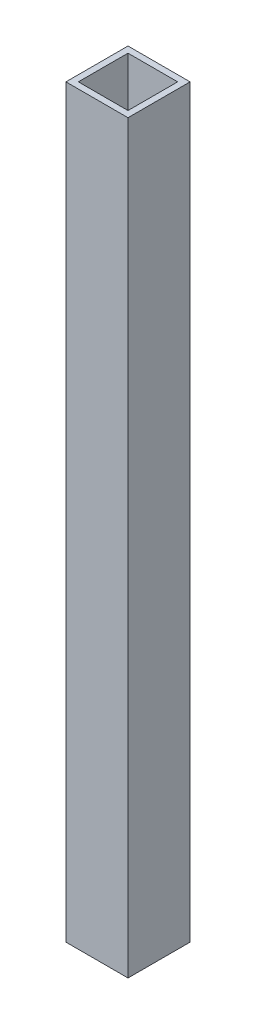
ISO-10303-21;
HEADER;
FILE_DESCRIPTION(('STEP AP214'),'2;1');
FILE_NAME('part.step','',(''),(''),'','','');
FILE_SCHEMA(('AUTOMOTIVE_DESIGN { 1 0 10303 214 1 1 1 1 }'));
ENDSEC;
DATA;
#1=APPLICATION_CONTEXT('core data for automotive mechanical design processes');
#2=APPLICATION_PROTOCOL_DEFINITION('international standard','automotive_design',2000,#1);
#3=PRODUCT_CONTEXT('',#1,'mechanical');
#4=PRODUCT('Part','Part','',(#3));
#5=PRODUCT_RELATED_PRODUCT_CATEGORY('part','',(#4));
#6=PRODUCT_DEFINITION_FORMATION('','',#4);
#7=PRODUCT_DEFINITION_CONTEXT('part definition',#1,'design');
#8=PRODUCT_DEFINITION('design','',#6,#7);
#9=PRODUCT_DEFINITION_SHAPE('','',#8);
#10=(LENGTH_UNIT() NAMED_UNIT(*) SI_UNIT(.MILLI.,.METRE.));
#11=(NAMED_UNIT(*) PLANE_ANGLE_UNIT() SI_UNIT($,.RADIAN.));
#12=(NAMED_UNIT(*) SI_UNIT($,.STERADIAN.) SOLID_ANGLE_UNIT());
#13=UNCERTAINTY_MEASURE_WITH_UNIT(LENGTH_MEASURE(1.E-05),#10,'distance_accuracy_value','');
#14=(GEOMETRIC_REPRESENTATION_CONTEXT(3) GLOBAL_UNCERTAINTY_ASSIGNED_CONTEXT((#13)) GLOBAL_UNIT_ASSIGNED_CONTEXT((#10,
#11,#12)) REPRESENTATION_CONTEXT('',''));
#15=CARTESIAN_POINT('',(0.,0.,0.));
#16=DIRECTION('',(0.,0.,1.));
#17=DIRECTION('',(1.,0.,0.));
#18=AXIS2_PLACEMENT_3D('',#15,#16,#17);
#19=CARTESIAN_POINT('',(0.,120.,0.));
#20=DIRECTION('',(0.,1.,0.));
#21=DIRECTION('',(0.,0.,1.));
#22=AXIS2_PLACEMENT_3D('',#19,#20,#21);
#23=PLANE('',#22);
#24=DIRECTION('',(0.,0.,-1.));
#25=VECTOR('',#24,1.);
#26=CARTESIAN_POINT('',(5.,120.,-5.));
#27=LINE('',#26,#25);
#28=CARTESIAN_POINT('',(5.,120.,5.));
#29=VERTEX_POINT('',#28);
#30=CARTESIAN_POINT('',(5.,120.,-5.));
#31=VERTEX_POINT('',#30);
#32=EDGE_CURVE('E142',#29,#31,#27,.T.);
#33=ORIENTED_EDGE('',*,*,#32,.T.);
#34=DIRECTION('',(-1.,0.,0.));
#35=VECTOR('',#34,1.);
#36=CARTESIAN_POINT('',(-5.,120.,-5.));
#37=LINE('',#36,#35);
#38=CARTESIAN_POINT('',(-5.,120.,-5.));
#39=VERTEX_POINT('',#38);
#40=EDGE_CURVE('E144',#31,#39,#37,.T.);
#41=ORIENTED_EDGE('',*,*,#40,.T.);
#42=DIRECTION('',(0.,0.,1.));
#43=VECTOR('',#42,1.);
#44=CARTESIAN_POINT('',(-5.,120.,-5.));
#45=LINE('',#44,#43);
#46=CARTESIAN_POINT('',(-5.,120.,5.));
#47=VERTEX_POINT('',#46);
#48=EDGE_CURVE('E146',#39,#47,#45,.T.);
#49=ORIENTED_EDGE('',*,*,#48,.T.);
#50=DIRECTION('',(1.,0.,0.));
#51=VECTOR('',#50,1.);
#52=CARTESIAN_POINT('',(-5.,120.,5.));
#53=LINE('',#52,#51);
#54=EDGE_CURVE('E147',#47,#29,#53,.T.);
#55=ORIENTED_EDGE('',*,*,#54,.T.);
#56=EDGE_LOOP('',(#33,#41,#49,#55));
#57=FACE_BOUND('',#56,.T.);
#58=DIRECTION('',(-1.,0.,0.));
#59=VECTOR('',#58,1.);
#60=CARTESIAN_POINT('',(-4.,120.,-4.));
#61=LINE('',#60,#59);
#62=CARTESIAN_POINT('',(4.,120.,-4.));
#63=VERTEX_POINT('',#62);
#64=CARTESIAN_POINT('',(-4.,120.,-4.));
#65=VERTEX_POINT('',#64);
#66=EDGE_CURVE('E111',#63,#65,#61,.T.);
#67=ORIENTED_EDGE('',*,*,#66,.F.);
#68=DIRECTION('',(0.,0.,-1.));
#69=VECTOR('',#68,1.);
#70=CARTESIAN_POINT('',(4.,120.,-4.));
#71=LINE('',#70,#69);
#72=CARTESIAN_POINT('',(4.,120.,4.));
#73=VERTEX_POINT('',#72);
#74=EDGE_CURVE('E106',#73,#63,#71,.T.);
#75=ORIENTED_EDGE('',*,*,#74,.F.);
#76=DIRECTION('',(1.,0.,0.));
#77=VECTOR('',#76,1.);
#78=CARTESIAN_POINT('',(-4.,120.,4.));
#79=LINE('',#78,#77);
#80=CARTESIAN_POINT('',(-4.,120.,4.));
#81=VERTEX_POINT('',#80);
#82=EDGE_CURVE('E126',#81,#73,#79,.T.);
#83=ORIENTED_EDGE('',*,*,#82,.F.);
#84=DIRECTION('',(0.,0.,1.));
#85=VECTOR('',#84,1.);
#86=CARTESIAN_POINT('',(-4.,120.,-4.));
#87=LINE('',#86,#85);
#88=EDGE_CURVE('E127',#65,#81,#87,.T.);
#89=ORIENTED_EDGE('',*,*,#88,.F.);
#90=EDGE_LOOP('',(#67,#75,#83,#89));
#91=FACE_BOUND('',#90,.T.);
#92=ADVANCED_FACE('F41',(#57,#91),#23,.T.);
#93=CARTESIAN_POINT('',(0.,0.,0.));
#94=DIRECTION('',(0.,1.,0.));
#95=DIRECTION('',(0.,0.,1.));
#96=AXIS2_PLACEMENT_3D('',#93,#94,#95);
#97=PLANE('',#96);
#98=DIRECTION('',(0.,0.,-1.));
#99=VECTOR('',#98,1.);
#100=CARTESIAN_POINT('',(5.,0.,-5.));
#101=LINE('',#100,#99);
#102=CARTESIAN_POINT('',(5.,0.,5.));
#103=VERTEX_POINT('',#102);
#104=CARTESIAN_POINT('',(5.,0.,-5.));
#105=VERTEX_POINT('',#104);
#106=EDGE_CURVE('E124',#103,#105,#101,.T.);
#107=ORIENTED_EDGE('',*,*,#106,.F.);
#108=DIRECTION('',(1.,0.,0.));
#109=VECTOR('',#108,1.);
#110=CARTESIAN_POINT('',(-5.,0.,5.));
#111=LINE('',#110,#109);
#112=CARTESIAN_POINT('',(-5.,0.,5.));
#113=VERTEX_POINT('',#112);
#114=EDGE_CURVE('E148',#113,#103,#111,.T.);
#115=ORIENTED_EDGE('',*,*,#114,.F.);
#116=DIRECTION('',(0.,0.,1.));
#117=VECTOR('',#116,1.);
#118=CARTESIAN_POINT('',(-5.,0.,-5.));
#119=LINE('',#118,#117);
#120=CARTESIAN_POINT('',(-5.,0.,-5.));
#121=VERTEX_POINT('',#120);
#122=EDGE_CURVE('E160',#121,#113,#119,.T.);
#123=ORIENTED_EDGE('',*,*,#122,.F.);
#124=DIRECTION('',(-1.,0.,0.));
#125=VECTOR('',#124,1.);
#126=CARTESIAN_POINT('',(-5.,0.,-5.));
#127=LINE('',#126,#125);
#128=EDGE_CURVE('E154',#105,#121,#127,.T.);
#129=ORIENTED_EDGE('',*,*,#128,.F.);
#130=EDGE_LOOP('',(#107,#115,#123,#129));
#131=FACE_BOUND('',#130,.T.);
#132=DIRECTION('',(0.,0.,-1.));
#133=VECTOR('',#132,1.);
#134=CARTESIAN_POINT('',(4.,0.,-4.));
#135=LINE('',#134,#133);
#136=CARTESIAN_POINT('',(4.,0.,4.));
#137=VERTEX_POINT('',#136);
#138=CARTESIAN_POINT('',(4.,0.,-4.));
#139=VERTEX_POINT('',#138);
#140=EDGE_CURVE('E63',#137,#139,#135,.T.);
#141=ORIENTED_EDGE('',*,*,#140,.T.);
#142=DIRECTION('',(-1.,0.,0.));
#143=VECTOR('',#142,1.);
#144=CARTESIAN_POINT('',(-4.,0.,-4.));
#145=LINE('',#144,#143);
#146=CARTESIAN_POINT('',(-4.,0.,-4.));
#147=VERTEX_POINT('',#146);
#148=EDGE_CURVE('E123',#139,#147,#145,.T.);
#149=ORIENTED_EDGE('',*,*,#148,.T.);
#150=DIRECTION('',(0.,0.,1.));
#151=VECTOR('',#150,1.);
#152=CARTESIAN_POINT('',(-4.,0.,-4.));
#153=LINE('',#152,#151);
#154=CARTESIAN_POINT('',(-4.,0.,4.));
#155=VERTEX_POINT('',#154);
#156=EDGE_CURVE('E133',#147,#155,#153,.T.);
#157=ORIENTED_EDGE('',*,*,#156,.T.);
#158=DIRECTION('',(1.,0.,0.));
#159=VECTOR('',#158,1.);
#160=CARTESIAN_POINT('',(-4.,0.,4.));
#161=LINE('',#160,#159);
#162=EDGE_CURVE('E113',#155,#137,#161,.T.);
#163=ORIENTED_EDGE('',*,*,#162,.T.);
#164=EDGE_LOOP('',(#141,#149,#157,#163));
#165=FACE_BOUND('',#164,.T.);
#166=ADVANCED_FACE('F175',(#131,#165),#97,.F.);
#167=CARTESIAN_POINT('',(5.,120.,-5.));
#168=DIRECTION('',(-1.,0.,0.));
#169=DIRECTION('',(0.,0.,1.));
#170=AXIS2_PLACEMENT_3D('',#167,#168,#169);
#171=PLANE('',#170);
#172=ORIENTED_EDGE('',*,*,#106,.T.);
#173=DIRECTION('',(0.,-1.,0.));
#174=VECTOR('',#173,1.);
#175=CARTESIAN_POINT('',(5.,120.,-5.));
#176=LINE('',#175,#174);
#177=EDGE_CURVE('E11',#31,#105,#176,.T.);
#178=ORIENTED_EDGE('',*,*,#177,.F.);
#179=ORIENTED_EDGE('',*,*,#32,.F.);
#180=DIRECTION('',(0.,-1.,0.));
#181=VECTOR('',#180,1.);
#182=CARTESIAN_POINT('',(5.,120.,5.));
#183=LINE('',#182,#181);
#184=EDGE_CURVE('E155',#29,#103,#183,.T.);
#185=ORIENTED_EDGE('',*,*,#184,.T.);
#186=EDGE_LOOP('',(#172,#178,#179,#185));
#187=FACE_BOUND('',#186,.T.);
#188=ADVANCED_FACE('F43',(#187),#171,.F.);
#189=CARTESIAN_POINT('',(-5.,120.,-5.));
#190=DIRECTION('',(0.,0.,1.));
#191=DIRECTION('',(1.,0.,0.));
#192=AXIS2_PLACEMENT_3D('',#189,#190,#191);
#193=PLANE('',#192);
#194=ORIENTED_EDGE('',*,*,#128,.T.);
#195=DIRECTION('',(0.,-1.,0.));
#196=VECTOR('',#195,1.);
#197=CARTESIAN_POINT('',(-5.,120.,-5.));
#198=LINE('',#197,#196);
#199=EDGE_CURVE('E47',#39,#121,#198,.T.);
#200=ORIENTED_EDGE('',*,*,#199,.F.);
#201=ORIENTED_EDGE('',*,*,#40,.F.);
#202=ORIENTED_EDGE('',*,*,#177,.T.);
#203=EDGE_LOOP('',(#194,#200,#201,#202));
#204=FACE_BOUND('',#203,.T.);
#205=ADVANCED_FACE('F183',(#204),#193,.F.);
#206=CARTESIAN_POINT('',(-5.,120.,-5.));
#207=DIRECTION('',(1.,0.,0.));
#208=DIRECTION('',(0.,0.,-1.));
#209=AXIS2_PLACEMENT_3D('',#206,#207,#208);
#210=PLANE('',#209);
#211=ORIENTED_EDGE('',*,*,#122,.T.);
#212=DIRECTION('',(0.,-1.,0.));
#213=VECTOR('',#212,1.);
#214=CARTESIAN_POINT('',(-5.,120.,5.));
#215=LINE('',#214,#213);
#216=EDGE_CURVE('E165',#47,#113,#215,.T.);
#217=ORIENTED_EDGE('',*,*,#216,.F.);
#218=ORIENTED_EDGE('',*,*,#48,.F.);
#219=ORIENTED_EDGE('',*,*,#199,.T.);
#220=EDGE_LOOP('',(#211,#217,#218,#219));
#221=FACE_BOUND('',#220,.T.);
#222=ADVANCED_FACE('F166',(#221),#210,.F.);
#223=CARTESIAN_POINT('',(-5.,120.,5.));
#224=DIRECTION('',(0.,0.,-1.));
#225=DIRECTION('',(-1.,0.,0.));
#226=AXIS2_PLACEMENT_3D('',#223,#224,#225);
#227=PLANE('',#226);
#228=ORIENTED_EDGE('',*,*,#114,.T.);
#229=ORIENTED_EDGE('',*,*,#184,.F.);
#230=ORIENTED_EDGE('',*,*,#54,.F.);
#231=ORIENTED_EDGE('',*,*,#216,.T.);
#232=EDGE_LOOP('',(#228,#229,#230,#231));
#233=FACE_BOUND('',#232,.T.);
#234=ADVANCED_FACE('F180',(#233),#227,.F.);
#235=CARTESIAN_POINT('',(4.,120.,-4.));
#236=DIRECTION('',(-1.,0.,0.));
#237=DIRECTION('',(0.,0.,1.));
#238=AXIS2_PLACEMENT_3D('',#235,#236,#237);
#239=PLANE('',#238);
#240=ORIENTED_EDGE('',*,*,#140,.F.);
#241=DIRECTION('',(0.,-1.,0.));
#242=VECTOR('',#241,1.);
#243=CARTESIAN_POINT('',(4.,120.,4.));
#244=LINE('',#243,#242);
#245=EDGE_CURVE('E109',#73,#137,#244,.T.);
#246=ORIENTED_EDGE('',*,*,#245,.F.);
#247=ORIENTED_EDGE('',*,*,#74,.T.);
#248=DIRECTION('',(0.,-1.,0.));
#249=VECTOR('',#248,1.);
#250=CARTESIAN_POINT('',(4.,120.,-4.));
#251=LINE('',#250,#249);
#252=EDGE_CURVE('E108',#63,#139,#251,.T.);
#253=ORIENTED_EDGE('',*,*,#252,.T.);
#254=EDGE_LOOP('',(#240,#246,#247,#253));
#255=FACE_BOUND('',#254,.T.);
#256=ADVANCED_FACE('F107',(#255),#239,.T.);
#257=CARTESIAN_POINT('',(-4.,120.,-4.));
#258=DIRECTION('',(0.,0.,1.));
#259=DIRECTION('',(1.,0.,0.));
#260=AXIS2_PLACEMENT_3D('',#257,#258,#259);
#261=PLANE('',#260);
#262=ORIENTED_EDGE('',*,*,#148,.F.);
#263=ORIENTED_EDGE('',*,*,#252,.F.);
#264=ORIENTED_EDGE('',*,*,#66,.T.);
#265=DIRECTION('',(0.,-1.,0.));
#266=VECTOR('',#265,1.);
#267=CARTESIAN_POINT('',(-4.,120.,-4.));
#268=LINE('',#267,#266);
#269=EDGE_CURVE('E122',#65,#147,#268,.T.);
#270=ORIENTED_EDGE('',*,*,#269,.T.);
#271=EDGE_LOOP('',(#262,#263,#264,#270));
#272=FACE_BOUND('',#271,.T.);
#273=ADVANCED_FACE('F119',(#272),#261,.T.);
#274=CARTESIAN_POINT('',(-4.,120.,-4.));
#275=DIRECTION('',(1.,0.,0.));
#276=DIRECTION('',(0.,0.,-1.));
#277=AXIS2_PLACEMENT_3D('',#274,#275,#276);
#278=PLANE('',#277);
#279=ORIENTED_EDGE('',*,*,#156,.F.);
#280=ORIENTED_EDGE('',*,*,#269,.F.);
#281=ORIENTED_EDGE('',*,*,#88,.T.);
#282=DIRECTION('',(0.,-1.,0.));
#283=VECTOR('',#282,1.);
#284=CARTESIAN_POINT('',(-4.,120.,4.));
#285=LINE('',#284,#283);
#286=EDGE_CURVE('E57',#81,#155,#285,.T.);
#287=ORIENTED_EDGE('',*,*,#286,.T.);
#288=EDGE_LOOP('',(#279,#280,#281,#287));
#289=FACE_BOUND('',#288,.T.);
#290=ADVANCED_FACE('F208',(#289),#278,.T.);
#291=CARTESIAN_POINT('',(-4.,120.,4.));
#292=DIRECTION('',(0.,0.,-1.));
#293=DIRECTION('',(-1.,0.,0.));
#294=AXIS2_PLACEMENT_3D('',#291,#292,#293);
#295=PLANE('',#294);
#296=ORIENTED_EDGE('',*,*,#162,.F.);
#297=ORIENTED_EDGE('',*,*,#286,.F.);
#298=ORIENTED_EDGE('',*,*,#82,.T.);
#299=ORIENTED_EDGE('',*,*,#245,.T.);
#300=EDGE_LOOP('',(#296,#297,#298,#299));
#301=FACE_BOUND('',#300,.T.);
#302=ADVANCED_FACE('F215',(#301),#295,.T.);
#303=CLOSED_SHELL('',(#92,#166,#188,#205,#222,#234,#256,#273,#290,#302));
#304=MANIFOLD_SOLID_BREP('B2',#303);
#305=ADVANCED_BREP_SHAPE_REPRESENTATION('',(#18,#304),#14);
#306=SHAPE_DEFINITION_REPRESENTATION(#9,#305);
ENDSEC;
END-ISO-10303-21;
